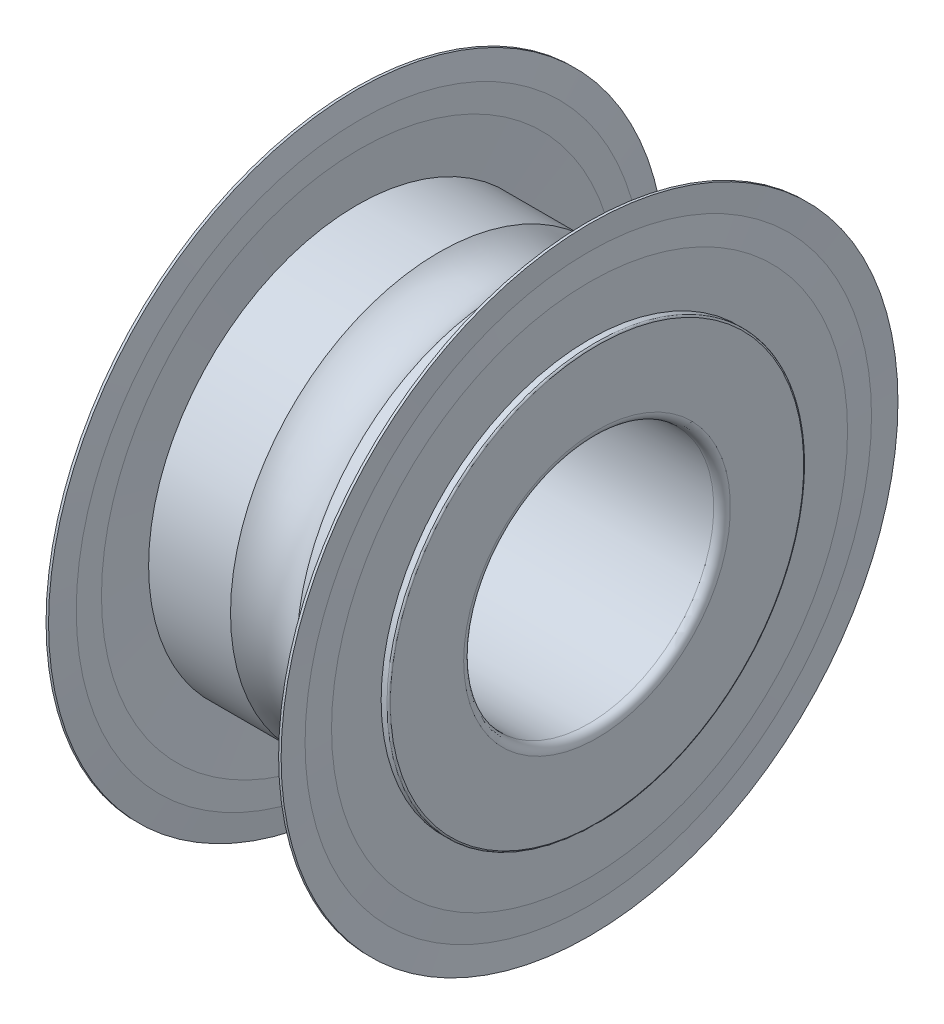
ISO-10303-21;
HEADER;
FILE_DESCRIPTION(('STEP AP214'),'2;1');
FILE_NAME('part.step','',(''),(''),'','','');
FILE_SCHEMA(('AUTOMOTIVE_DESIGN { 1 0 10303 214 1 1 1 1 }'));
ENDSEC;
DATA;
#1=APPLICATION_CONTEXT('core data for automotive mechanical design processes');
#2=APPLICATION_PROTOCOL_DEFINITION('international standard','automotive_design',2000,#1);
#3=PRODUCT_CONTEXT('',#1,'mechanical');
#4=PRODUCT('Part','Part','',(#3));
#5=PRODUCT_RELATED_PRODUCT_CATEGORY('part','',(#4));
#6=PRODUCT_DEFINITION_FORMATION('','',#4);
#7=PRODUCT_DEFINITION_CONTEXT('part definition',#1,'design');
#8=PRODUCT_DEFINITION('design','',#6,#7);
#9=PRODUCT_DEFINITION_SHAPE('','',#8);
#10=(LENGTH_UNIT() NAMED_UNIT(*) SI_UNIT(.MILLI.,.METRE.));
#11=(NAMED_UNIT(*) PLANE_ANGLE_UNIT() SI_UNIT($,.RADIAN.));
#12=(NAMED_UNIT(*) SI_UNIT($,.STERADIAN.) SOLID_ANGLE_UNIT());
#13=UNCERTAINTY_MEASURE_WITH_UNIT(LENGTH_MEASURE(1.E-05),#10,'distance_accuracy_value','');
#14=(GEOMETRIC_REPRESENTATION_CONTEXT(3) GLOBAL_UNCERTAINTY_ASSIGNED_CONTEXT((#13)) GLOBAL_UNIT_ASSIGNED_CONTEXT((#10,
#11,#12)) REPRESENTATION_CONTEXT('',''));
#15=CARTESIAN_POINT('',(0.,0.,0.));
#16=DIRECTION('',(0.,0.,1.));
#17=DIRECTION('',(1.,0.,0.));
#18=AXIS2_PLACEMENT_3D('',#15,#16,#17);
#19=CARTESIAN_POINT('',(50.,0.,0.));
#20=DIRECTION('',(-1.,0.,0.));
#21=DIRECTION('',(0.,0.,1.));
#22=AXIS2_PLACEMENT_3D('',#19,#20,#21);
#23=CYLINDRICAL_SURFACE('',#22,2.5);
#24=CARTESIAN_POINT('',(1.8968626966597,0.,0.));
#25=DIRECTION('',(-1.,0.,0.));
#26=DIRECTION('',(0.,0.,1.));
#27=AXIS2_PLACEMENT_3D('',#24,#25,#26);
#28=CIRCLE('',#27,2.5);
#29=CARTESIAN_POINT('',(1.8968626966597,0.,2.5));
#30=VERTEX_POINT('',#29);
#31=EDGE_CURVE('E71',#30,#30,#28,.T.);
#32=ORIENTED_EDGE('',*,*,#31,.F.);
#33=EDGE_LOOP('',(#32));
#34=FACE_BOUND('',#33,.T.);
#35=CARTESIAN_POINT('',(2.87950413223141,0.,0.));
#36=DIRECTION('',(-1.,0.,0.));
#37=DIRECTION('',(0.,0.,1.));
#38=AXIS2_PLACEMENT_3D('',#35,#36,#37);
#39=CIRCLE('',#38,2.5);
#40=CARTESIAN_POINT('',(2.87950413223141,0.,2.5));
#41=VERTEX_POINT('',#40);
#42=EDGE_CURVE('E10',#41,#41,#39,.F.);
#43=ORIENTED_EDGE('',*,*,#42,.F.);
#44=EDGE_LOOP('',(#43));
#45=FACE_BOUND('',#44,.T.);
#46=ADVANCED_FACE('F30',(#34,#45),#23,.T.);
#47=CARTESIAN_POINT('',(2.98,0.,0.));
#48=DIRECTION('',(-1.,0.,0.));
#49=DIRECTION('',(0.,0.,1.));
#50=AXIS2_PLACEMENT_3D('',#47,#48,#49);
#51=CIRCLE('',#50,2.5);
#52=CARTESIAN_POINT('',(2.98,0.,2.5));
#53=VERTEX_POINT('',#52);
#54=EDGE_CURVE('E68',#53,#53,#51,.T.);
#55=ORIENTED_EDGE('',*,*,#54,.T.);
#56=EDGE_LOOP('',(#55));
#57=FACE_BOUND('',#56,.T.);
#58=CARTESIAN_POINT('',(2.91,0.,0.));
#59=DIRECTION('',(-1.,0.,0.));
#60=DIRECTION('',(0.,0.,1.));
#61=AXIS2_PLACEMENT_3D('',#58,#59,#60);
#62=CIRCLE('',#61,2.5);
#63=CARTESIAN_POINT('',(2.91,0.,2.5));
#64=VERTEX_POINT('',#63);
#65=EDGE_CURVE('E37',#64,#64,#62,.T.);
#66=ORIENTED_EDGE('',*,*,#65,.F.);
#67=EDGE_LOOP('',(#66));
#68=FACE_BOUND('',#67,.T.);
#69=ADVANCED_FACE('F148',(#57,#68),#23,.T.);
#70=CARTESIAN_POINT('',(50.,0.,0.));
#71=DIRECTION('',(-1.,0.,0.));
#72=DIRECTION('',(0.,0.,1.));
#73=AXIS2_PLACEMENT_3D('',#70,#71,#72);
#74=CYLINDRICAL_SURFACE('',#73,2.5);
#75=CARTESIAN_POINT('',(0.0199999999999992,0.,0.));
#76=DIRECTION('',(-1.,0.,0.));
#77=DIRECTION('',(0.,0.,1.));
#78=AXIS2_PLACEMENT_3D('',#75,#76,#77);
#79=CIRCLE('',#78,2.5);
#80=CARTESIAN_POINT('',(0.0199999999999992,0.,2.5));
#81=VERTEX_POINT('',#80);
#82=EDGE_CURVE('E77',#81,#81,#79,.T.);
#83=ORIENTED_EDGE('',*,*,#82,.F.);
#84=EDGE_LOOP('',(#83));
#85=FACE_BOUND('',#84,.T.);
#86=CARTESIAN_POINT('',(0.0899999999999998,0.,0.));
#87=DIRECTION('',(1.,0.,0.));
#88=DIRECTION('',(0.,0.,-1.));
#89=AXIS2_PLACEMENT_3D('',#86,#87,#88);
#90=CIRCLE('',#89,2.5);
#91=CARTESIAN_POINT('',(0.0899999999999998,0.,-2.5));
#92=VERTEX_POINT('',#91);
#93=EDGE_CURVE('E41',#92,#92,#90,.T.);
#94=ORIENTED_EDGE('',*,*,#93,.F.);
#95=EDGE_LOOP('',(#94));
#96=FACE_BOUND('',#95,.T.);
#97=ADVANCED_FACE('F154',(#85,#96),#74,.T.);
#98=CARTESIAN_POINT('',(1.1031373033403,0.,0.));
#99=DIRECTION('',(-1.,0.,0.));
#100=DIRECTION('',(0.,0.,1.));
#101=AXIS2_PLACEMENT_3D('',#98,#99,#100);
#102=CIRCLE('',#101,2.5);
#103=CARTESIAN_POINT('',(1.1031373033403,0.,2.5));
#104=VERTEX_POINT('',#103);
#105=EDGE_CURVE('E74',#104,#104,#102,.T.);
#106=ORIENTED_EDGE('',*,*,#105,.T.);
#107=EDGE_LOOP('',(#106));
#108=FACE_BOUND('',#107,.T.);
#109=CARTESIAN_POINT('',(0.120495867768597,0.,0.));
#110=DIRECTION('',(1.,0.,0.));
#111=DIRECTION('',(0.,0.,-1.));
#112=AXIS2_PLACEMENT_3D('',#109,#110,#111);
#113=CIRCLE('',#112,2.5);
#114=CARTESIAN_POINT('',(0.120495867768597,0.,-2.5));
#115=VERTEX_POINT('',#114);
#116=EDGE_CURVE('E45',#115,#115,#113,.F.);
#117=ORIENTED_EDGE('',*,*,#116,.F.);
#118=EDGE_LOOP('',(#117));
#119=FACE_BOUND('',#118,.T.);
#120=ADVANCED_FACE('F187',(#108,#119),#74,.T.);
#121=CARTESIAN_POINT('',(0.0200000000000523,0.,0.));
#122=DIRECTION('',(-1.,0.,0.));
#123=DIRECTION('',(0.,0.,1.));
#124=AXIS2_PLACEMENT_3D('',#121,#122,#123);
#125=TOROIDAL_SURFACE('',#124,2.47999999999995,0.0200000000000522);
#126=CARTESIAN_POINT('',(0.,0.,0.));
#127=DIRECTION('',(-1.,0.,0.));
#128=DIRECTION('',(0.,0.,1.));
#129=AXIS2_PLACEMENT_3D('',#126,#127,#128);
#130=CIRCLE('',#129,2.48);
#131=CARTESIAN_POINT('',(0.,0.,2.48));
#132=VERTEX_POINT('',#131);
#133=EDGE_CURVE('E50',#132,#132,#130,.T.);
#134=ORIENTED_EDGE('',*,*,#133,.F.);
#135=EDGE_LOOP('',(#134));
#136=FACE_BOUND('',#135,.T.);
#137=ORIENTED_EDGE('',*,*,#82,.T.);
#138=EDGE_LOOP('',(#137));
#139=FACE_BOUND('',#138,.T.);
#140=ADVANCED_FACE('F32',(#136,#139),#125,.T.);
#141=CARTESIAN_POINT('',(0.,2.48,0.));
#142=DIRECTION('',(1.,0.,0.));
#143=DIRECTION('',(0.,0.,-1.));
#144=AXIS2_PLACEMENT_3D('',#141,#142,#143);
#145=PLANE('',#144);
#146=CARTESIAN_POINT('',(0.,0.,0.));
#147=DIRECTION('',(-1.,0.,0.));
#148=DIRECTION('',(0.,0.,1.));
#149=AXIS2_PLACEMENT_3D('',#146,#147,#148);
#150=CIRCLE('',#149,1.6);
#151=CARTESIAN_POINT('',(0.,0.,1.6));
#152=VERTEX_POINT('',#151);
#153=EDGE_CURVE('E53',#152,#152,#150,.T.);
#154=ORIENTED_EDGE('',*,*,#153,.F.);
#155=EDGE_LOOP('',(#154));
#156=FACE_BOUND('',#155,.T.);
#157=ORIENTED_EDGE('',*,*,#133,.T.);
#158=EDGE_LOOP('',(#157));
#159=FACE_BOUND('',#158,.T.);
#160=ADVANCED_FACE('F180',(#156,#159),#145,.F.);
#161=CARTESIAN_POINT('',(0.0999999999999222,0.,0.));
#162=DIRECTION('',(-1.,0.,0.));
#163=DIRECTION('',(0.,0.,1.));
#164=AXIS2_PLACEMENT_3D('',#161,#162,#163);
#165=TOROIDAL_SURFACE('',#164,1.59999999999992,0.0999999999999221);
#166=CARTESIAN_POINT('',(0.100000000000003,0.,0.));
#167=DIRECTION('',(-1.,0.,0.));
#168=DIRECTION('',(0.,0.,1.));
#169=AXIS2_PLACEMENT_3D('',#166,#167,#168);
#170=CIRCLE('',#169,1.5);
#171=CARTESIAN_POINT('',(0.100000000000003,0.,1.5));
#172=VERTEX_POINT('',#171);
#173=EDGE_CURVE('E56',#172,#172,#170,.T.);
#174=ORIENTED_EDGE('',*,*,#173,.F.);
#175=EDGE_LOOP('',(#174));
#176=FACE_BOUND('',#175,.T.);
#177=ORIENTED_EDGE('',*,*,#153,.T.);
#178=EDGE_LOOP('',(#177));
#179=FACE_BOUND('',#178,.T.);
#180=ADVANCED_FACE('F177',(#176,#179),#165,.T.);
#181=CARTESIAN_POINT('',(50.,0.,0.));
#182=DIRECTION('',(-1.,0.,0.));
#183=DIRECTION('',(0.,0.,1.));
#184=AXIS2_PLACEMENT_3D('',#181,#182,#183);
#185=CYLINDRICAL_SURFACE('',#184,1.5);
#186=CARTESIAN_POINT('',(2.9,0.,0.));
#187=DIRECTION('',(-1.,0.,0.));
#188=DIRECTION('',(0.,0.,1.));
#189=AXIS2_PLACEMENT_3D('',#186,#187,#188);
#190=CIRCLE('',#189,1.5);
#191=CARTESIAN_POINT('',(2.9,0.,1.5));
#192=VERTEX_POINT('',#191);
#193=EDGE_CURVE('E59',#192,#192,#190,.T.);
#194=ORIENTED_EDGE('',*,*,#193,.F.);
#195=EDGE_LOOP('',(#194));
#196=FACE_BOUND('',#195,.T.);
#197=ORIENTED_EDGE('',*,*,#173,.T.);
#198=EDGE_LOOP('',(#197));
#199=FACE_BOUND('',#198,.T.);
#200=ADVANCED_FACE('F173',(#196,#199),#185,.F.);
#201=CARTESIAN_POINT('',(2.90000000000015,0.,0.));
#202=DIRECTION('',(-1.,0.,0.));
#203=DIRECTION('',(0.,0.,1.));
#204=AXIS2_PLACEMENT_3D('',#201,#202,#203);
#205=TOROIDAL_SURFACE('',#204,1.59999999999985,0.0999999999998453);
#206=CARTESIAN_POINT('',(3.,0.,0.));
#207=DIRECTION('',(-1.,0.,0.));
#208=DIRECTION('',(0.,0.,1.));
#209=AXIS2_PLACEMENT_3D('',#206,#207,#208);
#210=CIRCLE('',#209,1.59999999999985);
#211=CARTESIAN_POINT('',(3.,0.,1.59999999999985));
#212=VERTEX_POINT('',#211);
#213=EDGE_CURVE('E62',#212,#212,#210,.T.);
#214=ORIENTED_EDGE('',*,*,#213,.F.);
#215=EDGE_LOOP('',(#214));
#216=FACE_BOUND('',#215,.T.);
#217=ORIENTED_EDGE('',*,*,#193,.T.);
#218=EDGE_LOOP('',(#217));
#219=FACE_BOUND('',#218,.T.);
#220=ADVANCED_FACE('F169',(#216,#219),#205,.T.);
#221=CARTESIAN_POINT('',(3.,1.6,0.));
#222=DIRECTION('',(-1.,0.,0.));
#223=DIRECTION('',(0.,0.,1.));
#224=AXIS2_PLACEMENT_3D('',#221,#222,#223);
#225=PLANE('',#224);
#226=CARTESIAN_POINT('',(3.,0.,0.));
#227=DIRECTION('',(-1.,0.,0.));
#228=DIRECTION('',(0.,0.,1.));
#229=AXIS2_PLACEMENT_3D('',#226,#227,#228);
#230=CIRCLE('',#229,2.48);
#231=CARTESIAN_POINT('',(3.,0.,2.48));
#232=VERTEX_POINT('',#231);
#233=EDGE_CURVE('E65',#232,#232,#230,.T.);
#234=ORIENTED_EDGE('',*,*,#233,.F.);
#235=EDGE_LOOP('',(#234));
#236=FACE_BOUND('',#235,.T.);
#237=ORIENTED_EDGE('',*,*,#213,.T.);
#238=EDGE_LOOP('',(#237));
#239=FACE_BOUND('',#238,.T.);
#240=ADVANCED_FACE('F165',(#236,#239),#225,.F.);
#241=CARTESIAN_POINT('',(2.97999999999989,0.,0.));
#242=DIRECTION('',(-1.,0.,0.));
#243=DIRECTION('',(0.,0.,1.));
#244=AXIS2_PLACEMENT_3D('',#241,#242,#243);
#245=TOROIDAL_SURFACE('',#244,2.4799999999999,0.0200000000001052);
#246=ORIENTED_EDGE('',*,*,#54,.F.);
#247=EDGE_LOOP('',(#246));
#248=FACE_BOUND('',#247,.T.);
#249=ORIENTED_EDGE('',*,*,#233,.T.);
#250=EDGE_LOOP('',(#249));
#251=FACE_BOUND('',#250,.T.);
#252=ADVANCED_FACE('F162',(#248,#251),#245,.T.);
#253=CARTESIAN_POINT('',(1.5,0.,0.));
#254=DIRECTION('',(-1.,0.,0.));
#255=DIRECTION('',(0.,0.,1.));
#256=AXIS2_PLACEMENT_3D('',#253,#254,#255);
#257=TOROIDAL_SURFACE('',#256,2.95000000000003,0.600000000000031);
#258=ORIENTED_EDGE('',*,*,#105,.F.);
#259=EDGE_LOOP('',(#258));
#260=FACE_BOUND('',#259,.T.);
#261=ORIENTED_EDGE('',*,*,#31,.T.);
#262=EDGE_LOOP('',(#261));
#263=FACE_BOUND('',#262,.T.);
#264=ADVANCED_FACE('F160',(#260,#263),#257,.F.);
#265=CARTESIAN_POINT('',(0.120000000000002,0.,0.));
#266=DIRECTION('',(1.,0.,0.));
#267=DIRECTION('',(0.,0.,-1.));
#268=AXIS2_PLACEMENT_3D('',#265,#266,#267);
#269=CONICAL_SURFACE('',#268,2.49,1.52125013220378);
#270=CARTESIAN_POINT('',(0.149999999999997,0.,0.));
#271=DIRECTION('',(-1.,0.,0.));
#272=DIRECTION('',(0.,0.,1.));
#273=AXIS2_PLACEMENT_3D('',#270,#271,#272);
#274=CIRCLE('',#273,3.095);
#275=CARTESIAN_POINT('',(0.149999999999997,0.,3.095));
#276=VERTEX_POINT('',#275);
#277=EDGE_CURVE('E89',#276,#276,#274,.T.);
#278=ORIENTED_EDGE('',*,*,#277,.F.);
#279=EDGE_LOOP('',(#278));
#280=FACE_BOUND('',#279,.T.);
#281=ORIENTED_EDGE('',*,*,#116,.T.);
#282=EDGE_LOOP('',(#281));
#283=FACE_BOUND('',#282,.T.);
#284=ADVANCED_FACE('F221',(#280,#283),#269,.F.);
#285=CARTESIAN_POINT('',(50.,0.,0.));
#286=DIRECTION('',(-1.,0.,0.));
#287=DIRECTION('',(0.,0.,1.));
#288=AXIS2_PLACEMENT_3D('',#285,#286,#287);
#289=CYLINDRICAL_SURFACE('',#288,3.7);
#290=CARTESIAN_POINT('',(0.0899999999999998,0.,0.));
#291=DIRECTION('',(-1.,0.,0.));
#292=DIRECTION('',(0.,0.,1.));
#293=AXIS2_PLACEMENT_3D('',#290,#291,#292);
#294=CIRCLE('',#293,3.7);
#295=CARTESIAN_POINT('',(0.0899999999999998,0.,3.7));
#296=VERTEX_POINT('',#295);
#297=EDGE_CURVE('E80',#296,#296,#294,.T.);
#298=ORIENTED_EDGE('',*,*,#297,.F.);
#299=EDGE_LOOP('',(#298));
#300=FACE_BOUND('',#299,.T.);
#301=CARTESIAN_POINT('',(0.120000000000002,0.,0.));
#302=DIRECTION('',(-1.,0.,0.));
#303=DIRECTION('',(0.,0.,1.));
#304=AXIS2_PLACEMENT_3D('',#301,#302,#303);
#305=CIRCLE('',#304,3.7);
#306=CARTESIAN_POINT('',(0.120000000000002,0.,3.7));
#307=VERTEX_POINT('',#306);
#308=EDGE_CURVE('E95',#307,#307,#305,.T.);
#309=ORIENTED_EDGE('',*,*,#308,.T.);
#310=EDGE_LOOP('',(#309));
#311=FACE_BOUND('',#310,.T.);
#312=ADVANCED_FACE('F215',(#300,#311),#289,.T.);
#313=CARTESIAN_POINT('',(0.0899999999999998,0.,0.));
#314=DIRECTION('',(-1.,0.,0.));
#315=DIRECTION('',(0.,0.,1.));
#316=AXIS2_PLACEMENT_3D('',#313,#314,#315);
#317=CONICAL_SURFACE('',#316,3.7,1.52125013220377);
#318=CARTESIAN_POINT('',(0.105000000000001,0.,0.));
#319=DIRECTION('',(-1.,0.,0.));
#320=DIRECTION('',(0.,0.,1.));
#321=AXIS2_PLACEMENT_3D('',#318,#319,#320);
#322=CIRCLE('',#321,3.3975);
#323=CARTESIAN_POINT('',(0.105000000000001,0.,3.3975));
#324=VERTEX_POINT('',#323);
#325=EDGE_CURVE('E83',#324,#324,#322,.T.);
#326=ORIENTED_EDGE('',*,*,#325,.F.);
#327=EDGE_LOOP('',(#326));
#328=FACE_BOUND('',#327,.T.);
#329=ORIENTED_EDGE('',*,*,#297,.T.);
#330=EDGE_LOOP('',(#329));
#331=FACE_BOUND('',#330,.T.);
#332=ADVANCED_FACE('F209',(#328,#331),#317,.F.);
#333=CARTESIAN_POINT('',(0.105000000000001,0.,0.));
#334=DIRECTION('',(1.,0.,0.));
#335=DIRECTION('',(0.,0.,-1.));
#336=AXIS2_PLACEMENT_3D('',#333,#334,#335);
#337=CONICAL_SURFACE('',#336,3.3975,1.52125013220377);
#338=CARTESIAN_POINT('',(0.0899999999999998,0.,0.));
#339=DIRECTION('',(-1.,0.,0.));
#340=DIRECTION('',(0.,0.,1.));
#341=AXIS2_PLACEMENT_3D('',#338,#339,#340);
#342=CIRCLE('',#341,3.095);
#343=CARTESIAN_POINT('',(0.0899999999999998,0.,3.095));
#344=VERTEX_POINT('',#343);
#345=EDGE_CURVE('E86',#344,#344,#342,.T.);
#346=ORIENTED_EDGE('',*,*,#345,.F.);
#347=EDGE_LOOP('',(#346));
#348=FACE_BOUND('',#347,.T.);
#349=ORIENTED_EDGE('',*,*,#325,.T.);
#350=EDGE_LOOP('',(#349));
#351=FACE_BOUND('',#350,.T.);
#352=ADVANCED_FACE('F203',(#348,#351),#337,.T.);
#353=CARTESIAN_POINT('',(0.09,3.095,0.));
#354=DIRECTION('',(1.,0.,0.));
#355=DIRECTION('',(0.,0.,-1.));
#356=AXIS2_PLACEMENT_3D('',#353,#354,#355);
#357=PLANE('',#356);
#358=ORIENTED_EDGE('',*,*,#93,.T.);
#359=EDGE_LOOP('',(#358));
#360=FACE_BOUND('',#359,.T.);
#361=ORIENTED_EDGE('',*,*,#345,.T.);
#362=EDGE_LOOP('',(#361));
#363=FACE_BOUND('',#362,.T.);
#364=ADVANCED_FACE('F199',(#360,#363),#357,.F.);
#365=CARTESIAN_POINT('',(0.15,3.095,0.));
#366=DIRECTION('',(-1.,0.,0.));
#367=DIRECTION('',(0.,0.,1.));
#368=AXIS2_PLACEMENT_3D('',#365,#366,#367);
#369=PLANE('',#368);
#370=CARTESIAN_POINT('',(0.149999999999997,0.,0.));
#371=DIRECTION('',(-1.,0.,0.));
#372=DIRECTION('',(0.,0.,1.));
#373=AXIS2_PLACEMENT_3D('',#370,#371,#372);
#374=CIRCLE('',#373,3.3975);
#375=CARTESIAN_POINT('',(0.149999999999997,0.,3.3975));
#376=VERTEX_POINT('',#375);
#377=EDGE_CURVE('E92',#376,#376,#374,.T.);
#378=ORIENTED_EDGE('',*,*,#377,.F.);
#379=EDGE_LOOP('',(#378));
#380=FACE_BOUND('',#379,.T.);
#381=ORIENTED_EDGE('',*,*,#277,.T.);
#382=EDGE_LOOP('',(#381));
#383=FACE_BOUND('',#382,.T.);
#384=ADVANCED_FACE('F202',(#380,#383),#369,.F.);
#385=CARTESIAN_POINT('',(0.149999999999997,0.,0.));
#386=DIRECTION('',(-1.,0.,0.));
#387=DIRECTION('',(0.,0.,1.));
#388=AXIS2_PLACEMENT_3D('',#385,#386,#387);
#389=CONICAL_SURFACE('',#388,3.3975,1.47194600472665);
#390=ORIENTED_EDGE('',*,*,#308,.F.);
#391=EDGE_LOOP('',(#390));
#392=FACE_BOUND('',#391,.T.);
#393=ORIENTED_EDGE('',*,*,#377,.T.);
#394=EDGE_LOOP('',(#393));
#395=FACE_BOUND('',#394,.T.);
#396=ADVANCED_FACE('F225',(#392,#395),#389,.T.);
#397=CARTESIAN_POINT('',(2.85,0.,0.));
#398=DIRECTION('',(-1.,0.,0.));
#399=DIRECTION('',(0.,0.,1.));
#400=AXIS2_PLACEMENT_3D('',#397,#398,#399);
#401=CONICAL_SURFACE('',#400,3.095,1.52125013220377);
#402=CARTESIAN_POINT('',(2.85,0.,0.));
#403=DIRECTION('',(-1.,0.,0.));
#404=DIRECTION('',(0.,0.,1.));
#405=AXIS2_PLACEMENT_3D('',#402,#403,#404);
#406=CIRCLE('',#405,3.095);
#407=CARTESIAN_POINT('',(2.85,0.,3.095));
#408=VERTEX_POINT('',#407);
#409=EDGE_CURVE('E101',#408,#408,#406,.T.);
#410=ORIENTED_EDGE('',*,*,#409,.T.);
#411=EDGE_LOOP('',(#410));
#412=FACE_BOUND('',#411,.T.);
#413=ORIENTED_EDGE('',*,*,#42,.T.);
#414=EDGE_LOOP('',(#413));
#415=FACE_BOUND('',#414,.T.);
#416=ADVANCED_FACE('F228',(#412,#415),#401,.F.);
#417=CARTESIAN_POINT('',(2.88,0.,0.));
#418=DIRECTION('',(1.,0.,0.));
#419=DIRECTION('',(0.,0.,-1.));
#420=AXIS2_PLACEMENT_3D('',#417,#418,#419);
#421=CONICAL_SURFACE('',#420,3.7,1.47194600472662);
#422=CARTESIAN_POINT('',(2.85,0.,0.));
#423=DIRECTION('',(-1.,0.,0.));
#424=DIRECTION('',(0.,0.,1.));
#425=AXIS2_PLACEMENT_3D('',#422,#423,#424);
#426=CIRCLE('',#425,3.3975);
#427=CARTESIAN_POINT('',(2.85,0.,3.3975));
#428=VERTEX_POINT('',#427);
#429=EDGE_CURVE('E98',#428,#428,#426,.T.);
#430=ORIENTED_EDGE('',*,*,#429,.F.);
#431=EDGE_LOOP('',(#430));
#432=FACE_BOUND('',#431,.T.);
#433=CARTESIAN_POINT('',(2.88,0.,0.));
#434=DIRECTION('',(-1.,0.,0.));
#435=DIRECTION('',(0.,0.,1.));
#436=AXIS2_PLACEMENT_3D('',#433,#434,#435);
#437=CIRCLE('',#436,3.7);
#438=CARTESIAN_POINT('',(2.88,0.,3.7));
#439=VERTEX_POINT('',#438);
#440=EDGE_CURVE('E113',#439,#439,#437,.T.);
#441=ORIENTED_EDGE('',*,*,#440,.T.);
#442=EDGE_LOOP('',(#441));
#443=FACE_BOUND('',#442,.T.);
#444=ADVANCED_FACE('F117',(#432,#443),#421,.T.);
#445=CARTESIAN_POINT('',(2.85,3.3975,0.));
#446=DIRECTION('',(1.,0.,0.));
#447=DIRECTION('',(0.,0.,-1.));
#448=AXIS2_PLACEMENT_3D('',#445,#446,#447);
#449=PLANE('',#448);
#450=ORIENTED_EDGE('',*,*,#409,.F.);
#451=EDGE_LOOP('',(#450));
#452=FACE_BOUND('',#451,.T.);
#453=ORIENTED_EDGE('',*,*,#429,.T.);
#454=EDGE_LOOP('',(#453));
#455=FACE_BOUND('',#454,.T.);
#456=ADVANCED_FACE('F139',(#452,#455),#449,.F.);
#457=CARTESIAN_POINT('',(2.91,2.49,0.));
#458=DIRECTION('',(-1.,0.,0.));
#459=DIRECTION('',(0.,0.,1.));
#460=AXIS2_PLACEMENT_3D('',#457,#458,#459);
#461=PLANE('',#460);
#462=ORIENTED_EDGE('',*,*,#65,.T.);
#463=EDGE_LOOP('',(#462));
#464=FACE_BOUND('',#463,.T.);
#465=CARTESIAN_POINT('',(2.91,0.,0.));
#466=DIRECTION('',(-1.,0.,0.));
#467=DIRECTION('',(0.,0.,1.));
#468=AXIS2_PLACEMENT_3D('',#465,#466,#467);
#469=CIRCLE('',#468,3.095);
#470=CARTESIAN_POINT('',(2.91,0.,3.095));
#471=VERTEX_POINT('',#470);
#472=EDGE_CURVE('E104',#471,#471,#469,.T.);
#473=ORIENTED_EDGE('',*,*,#472,.F.);
#474=EDGE_LOOP('',(#473));
#475=FACE_BOUND('',#474,.T.);
#476=ADVANCED_FACE('F134',(#464,#475),#461,.F.);
#477=CARTESIAN_POINT('',(2.91,0.,0.));
#478=DIRECTION('',(-1.,0.,0.));
#479=DIRECTION('',(0.,0.,1.));
#480=AXIS2_PLACEMENT_3D('',#477,#478,#479);
#481=CONICAL_SURFACE('',#480,3.095,1.52125013220377);
#482=CARTESIAN_POINT('',(2.895,0.,0.));
#483=DIRECTION('',(-1.,0.,0.));
#484=DIRECTION('',(0.,0.,1.));
#485=AXIS2_PLACEMENT_3D('',#482,#483,#484);
#486=CIRCLE('',#485,3.3975);
#487=CARTESIAN_POINT('',(2.895,0.,3.3975));
#488=VERTEX_POINT('',#487);
#489=EDGE_CURVE('E107',#488,#488,#486,.T.);
#490=ORIENTED_EDGE('',*,*,#489,.F.);
#491=EDGE_LOOP('',(#490));
#492=FACE_BOUND('',#491,.T.);
#493=ORIENTED_EDGE('',*,*,#472,.T.);
#494=EDGE_LOOP('',(#493));
#495=FACE_BOUND('',#494,.T.);
#496=ADVANCED_FACE('F128',(#492,#495),#481,.T.);
#497=CARTESIAN_POINT('',(2.895,0.,0.));
#498=DIRECTION('',(1.,0.,0.));
#499=DIRECTION('',(0.,0.,-1.));
#500=AXIS2_PLACEMENT_3D('',#497,#498,#499);
#501=CONICAL_SURFACE('',#500,3.3975,1.52125013220377);
#502=CARTESIAN_POINT('',(2.91,0.,0.));
#503=DIRECTION('',(-1.,0.,0.));
#504=DIRECTION('',(0.,0.,1.));
#505=AXIS2_PLACEMENT_3D('',#502,#503,#504);
#506=CIRCLE('',#505,3.7);
#507=CARTESIAN_POINT('',(2.91,0.,3.7));
#508=VERTEX_POINT('',#507);
#509=EDGE_CURVE('E110',#508,#508,#506,.T.);
#510=ORIENTED_EDGE('',*,*,#509,.F.);
#511=EDGE_LOOP('',(#510));
#512=FACE_BOUND('',#511,.T.);
#513=ORIENTED_EDGE('',*,*,#489,.T.);
#514=EDGE_LOOP('',(#513));
#515=FACE_BOUND('',#514,.T.);
#516=ADVANCED_FACE('F122',(#512,#515),#501,.F.);
#517=CARTESIAN_POINT('',(50.,0.,0.));
#518=DIRECTION('',(-1.,0.,0.));
#519=DIRECTION('',(0.,0.,1.));
#520=AXIS2_PLACEMENT_3D('',#517,#518,#519);
#521=CYLINDRICAL_SURFACE('',#520,3.7);
#522=ORIENTED_EDGE('',*,*,#440,.F.);
#523=EDGE_LOOP('',(#522));
#524=FACE_BOUND('',#523,.T.);
#525=ORIENTED_EDGE('',*,*,#509,.T.);
#526=EDGE_LOOP('',(#525));
#527=FACE_BOUND('',#526,.T.);
#528=ADVANCED_FACE('F119',(#524,#527),#521,.T.);
#529=CLOSED_SHELL('',(#46,#69,#97,#120,#140,#160,#180,#200,#220,#240,#252,#264,#284,#312,#332,
#352,#364,#384,#396,#416,#444,#456,#476,#496,#516,#528));
#530=MANIFOLD_SOLID_BREP('B2',#529);
#531=ADVANCED_BREP_SHAPE_REPRESENTATION('',(#18,#530),#14);
#532=SHAPE_DEFINITION_REPRESENTATION(#9,#531);
ENDSEC;
END-ISO-10303-21;
